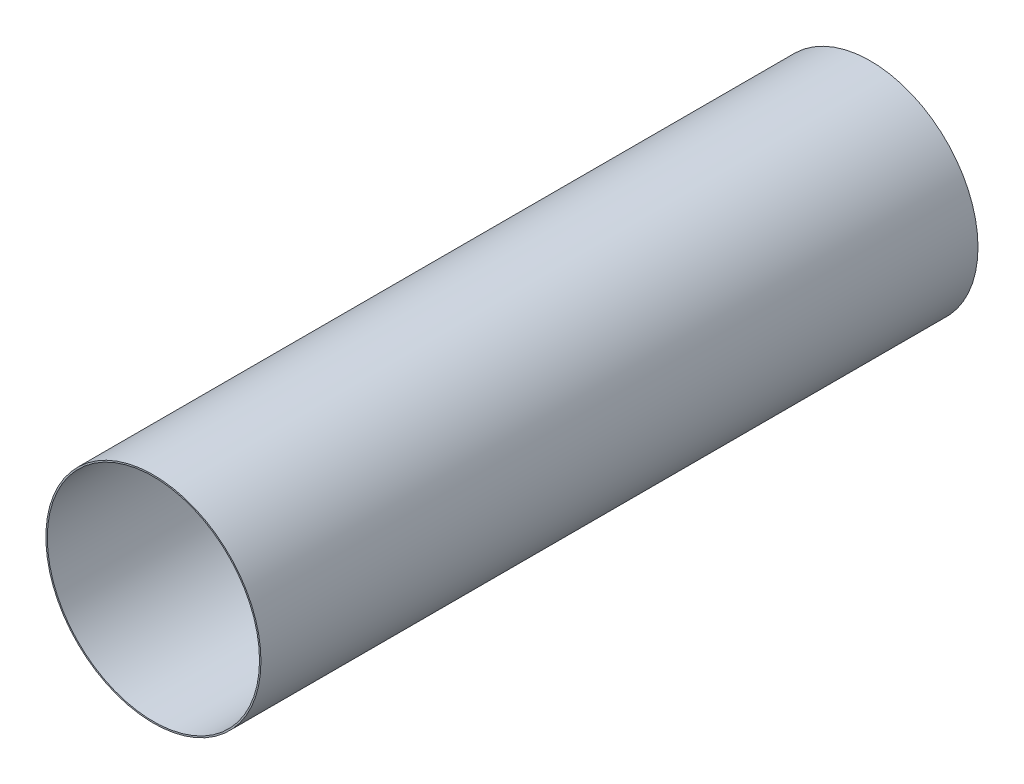
ISO-10303-21;
HEADER;
FILE_DESCRIPTION(('STEP AP214'),'2;1');
FILE_NAME('part.step','',(''),(''),'','','');
FILE_SCHEMA(('AUTOMOTIVE_DESIGN { 1 0 10303 214 1 1 1 1 }'));
ENDSEC;
DATA;
#1=APPLICATION_CONTEXT('core data for automotive mechanical design processes');
#2=APPLICATION_PROTOCOL_DEFINITION('international standard','automotive_design',2000,#1);
#3=PRODUCT_CONTEXT('',#1,'mechanical');
#4=PRODUCT('Part','Part','',(#3));
#5=PRODUCT_RELATED_PRODUCT_CATEGORY('part','',(#4));
#6=PRODUCT_DEFINITION_FORMATION('','',#4);
#7=PRODUCT_DEFINITION_CONTEXT('part definition',#1,'design');
#8=PRODUCT_DEFINITION('design','',#6,#7);
#9=PRODUCT_DEFINITION_SHAPE('','',#8);
#10=(LENGTH_UNIT() NAMED_UNIT(*) SI_UNIT(.MILLI.,.METRE.));
#11=(NAMED_UNIT(*) PLANE_ANGLE_UNIT() SI_UNIT($,.RADIAN.));
#12=(NAMED_UNIT(*) SI_UNIT($,.STERADIAN.) SOLID_ANGLE_UNIT());
#13=UNCERTAINTY_MEASURE_WITH_UNIT(LENGTH_MEASURE(1.E-05),#10,'distance_accuracy_value','');
#14=(GEOMETRIC_REPRESENTATION_CONTEXT(3) GLOBAL_UNCERTAINTY_ASSIGNED_CONTEXT((#13)) GLOBAL_UNIT_ASSIGNED_CONTEXT((#10,
#11,#12)) REPRESENTATION_CONTEXT('',''));
#15=CARTESIAN_POINT('',(0.,0.,0.));
#16=DIRECTION('',(0.,0.,1.));
#17=DIRECTION('',(1.,0.,0.));
#18=AXIS2_PLACEMENT_3D('',#15,#16,#17);
#19=CARTESIAN_POINT('',(0.,0.,1000.));
#20=DIRECTION('',(0.,0.,-1.));
#21=DIRECTION('',(-1.,0.,0.));
#22=AXIS2_PLACEMENT_3D('',#19,#20,#21);
#23=CYLINDRICAL_SURFACE('',#22,150.);
#24=CARTESIAN_POINT('',(0.,0.,1000.));
#25=DIRECTION('',(0.,0.,1.));
#26=DIRECTION('',(1.,0.,0.));
#27=AXIS2_PLACEMENT_3D('',#24,#25,#26);
#28=CIRCLE('',#27,150.);
#29=CARTESIAN_POINT('',(150.,0.,1000.));
#30=VERTEX_POINT('',#29);
#31=EDGE_CURVE('E10',#30,#30,#28,.T.);
#32=ORIENTED_EDGE('',*,*,#31,.F.);
#33=EDGE_LOOP('',(#32));
#34=FACE_BOUND('',#33,.T.);
#35=CARTESIAN_POINT('',(0.,0.,0.));
#36=DIRECTION('',(0.,0.,1.));
#37=DIRECTION('',(1.,0.,0.));
#38=AXIS2_PLACEMENT_3D('',#35,#36,#37);
#39=CIRCLE('',#38,150.);
#40=CARTESIAN_POINT('',(150.,0.,0.));
#41=VERTEX_POINT('',#40);
#42=EDGE_CURVE('E44',#41,#41,#39,.T.);
#43=ORIENTED_EDGE('',*,*,#42,.T.);
#44=EDGE_LOOP('',(#43));
#45=FACE_BOUND('',#44,.T.);
#46=ADVANCED_FACE('F41',(#34,#45),#23,.T.);
#47=CARTESIAN_POINT('',(0.,0.,1000.));
#48=DIRECTION('',(0.,0.,1.));
#49=DIRECTION('',(1.,0.,0.));
#50=AXIS2_PLACEMENT_3D('',#47,#48,#49);
#51=PLANE('',#50);
#52=CARTESIAN_POINT('',(0.,0.,1000.));
#53=DIRECTION('',(0.,0.,1.));
#54=DIRECTION('',(1.,0.,0.));
#55=AXIS2_PLACEMENT_3D('',#52,#53,#54);
#56=CIRCLE('',#55,148.);
#57=CARTESIAN_POINT('',(148.,0.,1000.));
#58=VERTEX_POINT('',#57);
#59=EDGE_CURVE('E53',#58,#58,#56,.T.);
#60=ORIENTED_EDGE('',*,*,#59,.F.);
#61=EDGE_LOOP('',(#60));
#62=FACE_BOUND('',#61,.T.);
#63=ORIENTED_EDGE('',*,*,#31,.T.);
#64=EDGE_LOOP('',(#63));
#65=FACE_BOUND('',#64,.T.);
#66=ADVANCED_FACE('F75',(#62,#65),#51,.T.);
#67=CARTESIAN_POINT('',(0.,0.,0.));
#68=DIRECTION('',(0.,0.,1.));
#69=DIRECTION('',(1.,0.,0.));
#70=AXIS2_PLACEMENT_3D('',#67,#68,#69);
#71=PLANE('',#70);
#72=ORIENTED_EDGE('',*,*,#42,.F.);
#73=EDGE_LOOP('',(#72));
#74=FACE_BOUND('',#73,.T.);
#75=ADVANCED_FACE('F67',(#74),#71,.F.);
#76=CARTESIAN_POINT('',(0.,0.,1000.));
#77=DIRECTION('',(0.,0.,-1.));
#78=DIRECTION('',(-1.,0.,0.));
#79=AXIS2_PLACEMENT_3D('',#76,#77,#78);
#80=CYLINDRICAL_SURFACE('',#79,148.);
#81=ORIENTED_EDGE('',*,*,#59,.T.);
#82=EDGE_LOOP('',(#81));
#83=FACE_BOUND('',#82,.T.);
#84=CARTESIAN_POINT('',(0.,0.,2.));
#85=DIRECTION('',(0.,0.,1.));
#86=DIRECTION('',(1.,0.,0.));
#87=AXIS2_PLACEMENT_3D('',#84,#85,#86);
#88=CIRCLE('',#87,148.);
#89=CARTESIAN_POINT('',(148.,0.,2.));
#90=VERTEX_POINT('',#89);
#91=EDGE_CURVE('E58',#90,#90,#88,.T.);
#92=ORIENTED_EDGE('',*,*,#91,.F.);
#93=EDGE_LOOP('',(#92));
#94=FACE_BOUND('',#93,.T.);
#95=ADVANCED_FACE('F65',(#83,#94),#80,.F.);
#96=CARTESIAN_POINT('',(0.,0.,2.));
#97=DIRECTION('',(0.,0.,1.));
#98=DIRECTION('',(1.,0.,0.));
#99=AXIS2_PLACEMENT_3D('',#96,#97,#98);
#100=PLANE('',#99);
#101=ORIENTED_EDGE('',*,*,#91,.T.);
#102=EDGE_LOOP('',(#101));
#103=FACE_BOUND('',#102,.T.);
#104=ADVANCED_FACE('F63',(#103),#100,.T.);
#105=CLOSED_SHELL('',(#46,#66,#75,#95,#104));
#106=MANIFOLD_SOLID_BREP('B2',#105);
#107=ADVANCED_BREP_SHAPE_REPRESENTATION('',(#18,#106),#14);
#108=SHAPE_DEFINITION_REPRESENTATION(#9,#107);
ENDSEC;
END-ISO-10303-21;
